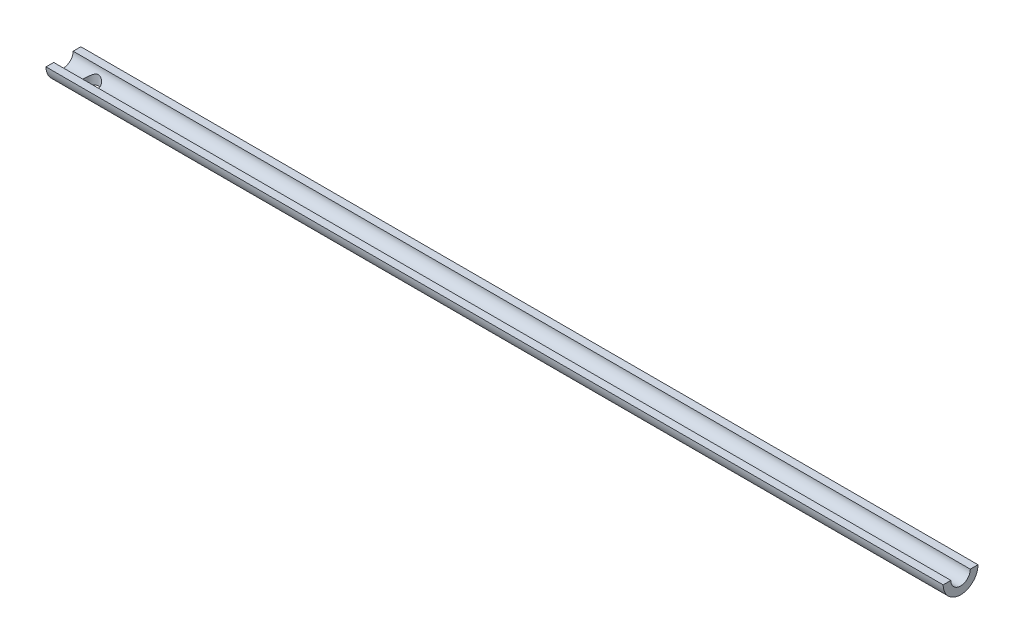
ISO-10303-21;
HEADER;
FILE_DESCRIPTION(('STEP AP214'),'2;1');
FILE_NAME('part.step','',(''),(''),'','','');
FILE_SCHEMA(('AUTOMOTIVE_DESIGN { 1 0 10303 214 1 1 1 1 }'));
ENDSEC;
DATA;
#1=APPLICATION_CONTEXT('core data for automotive mechanical design processes');
#2=APPLICATION_PROTOCOL_DEFINITION('international standard','automotive_design',2000,#1);
#3=PRODUCT_CONTEXT('',#1,'mechanical');
#4=PRODUCT('Part','Part','',(#3));
#5=PRODUCT_RELATED_PRODUCT_CATEGORY('part','',(#4));
#6=PRODUCT_DEFINITION_FORMATION('','',#4);
#7=PRODUCT_DEFINITION_CONTEXT('part definition',#1,'design');
#8=PRODUCT_DEFINITION('design','',#6,#7);
#9=PRODUCT_DEFINITION_SHAPE('','',#8);
#10=(LENGTH_UNIT() NAMED_UNIT(*) SI_UNIT(.MILLI.,.METRE.));
#11=(NAMED_UNIT(*) PLANE_ANGLE_UNIT() SI_UNIT($,.RADIAN.));
#12=(NAMED_UNIT(*) SI_UNIT($,.STERADIAN.) SOLID_ANGLE_UNIT());
#13=UNCERTAINTY_MEASURE_WITH_UNIT(LENGTH_MEASURE(1.E-05),#10,'distance_accuracy_value','');
#14=(GEOMETRIC_REPRESENTATION_CONTEXT(3) GLOBAL_UNCERTAINTY_ASSIGNED_CONTEXT((#13)) GLOBAL_UNIT_ASSIGNED_CONTEXT((#10,
#11,#12)) REPRESENTATION_CONTEXT('',''));
#15=CARTESIAN_POINT('',(0.,0.,0.));
#16=DIRECTION('',(0.,0.,1.));
#17=DIRECTION('',(1.,0.,0.));
#18=AXIS2_PLACEMENT_3D('',#15,#16,#17);
#19=CARTESIAN_POINT('',(22.225,19.05,-19.05));
#20=DIRECTION('',(0.,-1.,0.));
#21=DIRECTION('',(0.,0.,-1.));
#22=AXIS2_PLACEMENT_3D('',#19,#20,#21);
#23=CYLINDRICAL_SURFACE('',#22,6.3881);
#24=CARTESIAN_POINT('',(22.225,14.2748168883277,-25.4381));
#25=CARTESIAN_POINT('',(22.1052327505586,14.274814039197,-25.438098820239));
#26=CARTESIAN_POINT('',(21.9854232199568,14.2702884914255,-25.434722705346));
#27=CARTESIAN_POINT('',(21.7467943496114,14.2524098727596,-25.4212984158853));
#28=CARTESIAN_POINT('',(21.6279757318108,14.2390508531921,-25.4112457451437));
#29=CARTESIAN_POINT('',(21.391989247755,14.2041124463885,-25.3846703843907));
#30=CARTESIAN_POINT('',(21.2748262908106,14.1825124472511,-25.3681314684063));
#31=CARTESIAN_POINT('',(21.0430772688876,14.1320222996425,-25.3289098996023));
#32=CARTESIAN_POINT('',(20.9284929760754,14.1031272949173,-25.3062231534574));
#33=CARTESIAN_POINT('',(20.6628937152636,14.0279344976932,-25.2461362464194));
#34=CARTESIAN_POINT('',(20.5131367742915,13.9790835823443,-25.2063647831223));
#35=CARTESIAN_POINT('',(20.2197915539984,13.872691360835,-25.1171643565981));
#36=CARTESIAN_POINT('',(20.0762034876994,13.8151497548793,-25.0677350601958));
#37=CARTESIAN_POINT('',(19.7949137156383,13.6935489766235,-24.9597591825487));
#38=CARTESIAN_POINT('',(19.6572275618893,13.6294739278967,-24.9011901993955));
#39=CARTESIAN_POINT('',(19.38806000359,13.4969026275026,-24.775526517402));
#40=CARTESIAN_POINT('',(19.2565784396296,13.4284064895305,-24.7084320377651));
#41=CARTESIAN_POINT('',(18.9529411283808,13.2631960363066,-24.5401352813238));
#42=CARTESIAN_POINT('',(18.7833861837941,13.165280037829,-24.4354036163811));
#43=CARTESIAN_POINT('',(18.4554127661199,12.9676436433518,-24.2111534456428));
#44=CARTESIAN_POINT('',(18.2969983423859,12.8679226076486,-24.0916296063123));
#45=CARTESIAN_POINT('',(17.9916955279358,12.6695771350591,-23.8381399094518));
#46=CARTESIAN_POINT('',(17.844797916668,12.5709518763171,-23.7041858133124));
#47=CARTESIAN_POINT('',(17.5630287768574,12.377227219413,-23.4219090426535));
#48=CARTESIAN_POINT('',(17.4281532350785,12.2821266508703,-23.2735911978334));
#49=CARTESIAN_POINT('',(17.1968030315328,12.116024581123,-22.9935009714856));
#50=CARTESIAN_POINT('',(17.0980096988068,12.0439771142936,-22.8642589194477));
#51=CARTESIAN_POINT('',(16.9094822217991,11.9048579164068,-22.5968083574661));
#52=CARTESIAN_POINT('',(16.8197463220996,11.8377852218613,-22.458601593532));
#53=CARTESIAN_POINT('',(16.6502489019262,11.7098953788035,-22.1736860304114));
#54=CARTESIAN_POINT('',(16.5704756501414,11.6490708881213,-22.0269875342961));
#55=CARTESIAN_POINT('',(16.4217248912558,11.5348081874029,-21.7254560091128));
#56=CARTESIAN_POINT('',(16.3527455885979,11.4813687490478,-21.570624338722));
#57=CARTESIAN_POINT('',(16.236800327613,11.391030518359,-21.2792890376119));
#58=CARTESIAN_POINT('',(16.1880784876675,11.3528545766901,-21.1438784582453));
#59=CARTESIAN_POINT('',(16.0995036586541,11.2831904619205,-20.8685221342051));
#60=CARTESIAN_POINT('',(16.0596489769715,11.2517010125157,-20.7285772609168));
#61=CARTESIAN_POINT('',(15.9893577143691,11.1960106550603,-20.4449632728009));
#62=CARTESIAN_POINT('',(15.9589179593264,11.1718072906723,-20.3012954308672));
#63=CARTESIAN_POINT('',(15.9078996341911,11.1311684808592,-20.0111256332983));
#64=CARTESIAN_POINT('',(15.8873211817279,11.1147331280937,-19.8646236438781));
#65=CARTESIAN_POINT('',(15.8563091344789,11.0899428570188,-19.5693389342992));
#66=CARTESIAN_POINT('',(15.8459116143604,11.0816166729331,-19.4205499878728));
#67=CARTESIAN_POINT('',(15.8355683342188,11.0733339604599,-19.1223745389552));
#68=CARTESIAN_POINT('',(15.8356225943578,11.0733774482177,-18.9729880353119));
#69=CARTESIAN_POINT('',(15.8461821918462,11.08183330832,-18.674820165106));
#70=CARTESIAN_POINT('',(15.8566878632595,11.0902459481718,-18.5260388180391));
#71=CARTESIAN_POINT('',(15.8879682746795,11.1152500440522,-18.2302633786246));
#72=CARTESIAN_POINT('',(15.9087427748555,11.1318413090672,-18.0832692446184));
#73=CARTESIAN_POINT('',(15.9587988399754,11.17171120127,-17.8001806978062));
#74=CARTESIAN_POINT('',(15.9875478006364,11.194570357738,-17.663932376185));
#75=CARTESIAN_POINT('',(16.0535128731702,11.2468450892423,-17.394766708718));
#76=CARTESIAN_POINT('',(16.0907318592173,11.2762628897858,-17.2618505106137));
#77=CARTESIAN_POINT('',(16.2144072674728,11.373608880426,-16.8692305180578));
#78=CARTESIAN_POINT('',(16.3129176866269,11.4506583306336,-16.6154590497942));
#79=CARTESIAN_POINT('',(16.5487543799121,11.6327245816322,-16.104704906669));
#80=CARTESIAN_POINT('',(16.6889004366822,11.7397170423852,-15.849755763419));
#81=CARTESIAN_POINT('',(16.9979199787261,11.9708587232794,-15.3665496063558));
#82=CARTESIAN_POINT('',(17.1668093956242,12.0950174509934,-15.1383075145394));
#83=CARTESIAN_POINT('',(17.5670121213274,12.3810020543123,-14.665274929368));
#84=CARTESIAN_POINT('',(17.8040164577472,12.5453161145503,-14.4267751965018));
#85=CARTESIAN_POINT('',(18.1837107008651,12.794970708512,-14.0998748619976));
#86=CARTESIAN_POINT('',(18.3144433738575,12.8788011891895,-13.995965062543));
#87=CARTESIAN_POINT('',(18.5838879278762,13.0459289928987,-13.798522513847));
#88=CARTESIAN_POINT('',(18.7225988644655,13.1292263777442,-13.7049885401775));
#89=CARTESIAN_POINT('',(18.9945810952623,13.2857302297115,-13.5368040698004));
#90=CARTESIAN_POINT('',(19.1271442316493,13.359150887039,-13.4612053897186));
#91=CARTESIAN_POINT('',(19.3989101114831,13.5024049524905,-13.3189821428806));
#92=CARTESIAN_POINT('',(19.5381136329472,13.5722379382661,-13.2523586312096));
#93=CARTESIAN_POINT('',(19.8230448858232,13.7062186177797,-13.1286406029027));
#94=CARTESIAN_POINT('',(19.9687610275338,13.7703758495949,-13.0715299516153));
#95=CARTESIAN_POINT('',(20.2668341801483,13.8907208175741,-12.9673723099269));
#96=CARTESIAN_POINT('',(20.4191880812254,13.9469122343758,-12.92032066658));
#97=CARTESIAN_POINT('',(20.7912235461618,14.0683828350802,-12.8208690102389));
#98=CARTESIAN_POINT('',(21.0140304710439,14.1286869473467,-12.7735149467321));
#99=CARTESIAN_POINT('',(21.3550709422428,14.1975048821836,-12.7203624780865));
#100=CARTESIAN_POINT('',(21.4698259969392,14.216833239897,-12.7056278818068));
#101=CARTESIAN_POINT('',(21.7010015099083,14.2475153934693,-12.6823697504844));
#102=CARTESIAN_POINT('',(21.8174211522823,14.2588729681325,-12.6738432722132));
#103=CARTESIAN_POINT('',(22.0518034268537,14.2731181201431,-12.6631638607535));
#104=CARTESIAN_POINT('',(22.1697711544455,14.275952379488,-12.6610510477804));
#105=CARTESIAN_POINT('',(22.4055243717252,14.272859527311,-12.6633633503319));
#106=CARTESIAN_POINT('',(22.523309864435,14.2669325626669,-12.667788356253));
#107=CARTESIAN_POINT('',(22.7578335159747,14.2466033188336,-12.6830749223987));
#108=CARTESIAN_POINT('',(22.8745705150571,14.2321926057104,-12.6939428878268));
#109=CARTESIAN_POINT('',(23.1061001327548,14.1955559690321,-12.721880598897));
#110=CARTESIAN_POINT('',(23.2208916572662,14.173325791437,-12.738953720512));
#111=CARTESIAN_POINT('',(23.4763689472632,14.1155119007245,-12.7840060094082));
#112=CARTESIAN_POINT('',(23.6163197884937,14.0779768079834,-12.8136471467515));
#113=CARTESIAN_POINT('',(23.8914885447928,13.9940779011198,-12.8814709642971));
#114=CARTESIAN_POINT('',(24.0267024745981,13.9477068547341,-12.9196606460224));
#115=CARTESIAN_POINT('',(24.2923196201918,13.8479820640947,-13.0040527859047));
#116=CARTESIAN_POINT('',(24.4227106517279,13.7946120023126,-13.0502740534132));
#117=CARTESIAN_POINT('',(24.6782444374999,13.6827292792931,-13.1501501894327));
#118=CARTESIAN_POINT('',(24.8033887039598,13.6242181150877,-13.2038028965967));
#119=CARTESIAN_POINT('',(25.1052107630794,13.4756299814114,-13.3446216061781));
#120=CARTESIAN_POINT('',(25.2789862612766,13.3834582881012,-13.4358190301769));
#121=CARTESIAN_POINT('',(25.6158595113909,13.1950169831623,-13.632623988902));
#122=CARTESIAN_POINT('',(25.7789527938587,13.0987456837039,-13.7382374990531));
#123=CARTESIAN_POINT('',(26.0946198453451,12.9050183009142,-13.9635965218095));
#124=CARTESIAN_POINT('',(26.2471829686647,12.807561132448,-14.0833560134276));
#125=CARTESIAN_POINT('',(26.5413065650432,12.6141147392437,-14.3367225644051));
#126=CARTESIAN_POINT('',(26.6828687679256,12.5181252856313,-14.4703274389264));
#127=CARTESIAN_POINT('',(26.9564074532175,12.328486823226,-14.7533840791869));
#128=CARTESIAN_POINT('',(27.0882103425337,12.234893748223,-14.9030417320617));
#129=CARTESIAN_POINT('',(27.3388464398469,12.053837047129,-15.2163803190535));
#130=CARTESIAN_POINT('',(27.4576776089741,11.9663743853756,-15.3800634504718));
#131=CARTESIAN_POINT('',(27.6806361750933,11.800114304431,-15.7205626337706));
#132=CARTESIAN_POINT('',(27.7848030054089,11.7212937774841,-15.8973414355147));
#133=CARTESIAN_POINT('',(27.9770855754591,11.574371780693,-16.263596076572));
#134=CARTESIAN_POINT('',(28.065210382795,11.5062642584022,-16.4530646597339));
#135=CARTESIAN_POINT('',(28.1980367499377,11.4028819491454,-16.7804103597539));
#136=CARTESIAN_POINT('',(28.2475803737627,11.3640992374587,-16.9152387609548));
#137=CARTESIAN_POINT('',(28.3378678150898,11.2931484901818,-17.1894910725617));
#138=CARTESIAN_POINT('',(28.3786139262101,11.2609787306197,-17.3289137742256));
#139=CARTESIAN_POINT('',(28.4507449907862,11.2038678580281,-17.6115357425983));
#140=CARTESIAN_POINT('',(28.4821348986816,11.1789229193997,-17.7547329666805));
#141=CARTESIAN_POINT('',(28.535113997026,11.1367418140565,-18.0440626457928));
#142=CARTESIAN_POINT('',(28.5567028417334,11.1195059192857,-18.1901952041797));
#143=CARTESIAN_POINT('',(28.5897884243429,11.0930655453528,-18.4848850553982));
#144=CARTESIAN_POINT('',(28.6012469622067,11.083891467003,-18.6334493926056));
#145=CARTESIAN_POINT('',(28.6137360302897,11.0738914413023,-18.9312977313757));
#146=CARTESIAN_POINT('',(28.6147666013123,11.0730654612862,-19.08058173012));
#147=CARTESIAN_POINT('',(28.6063814203265,11.0797806612618,-19.3786739591682));
#148=CARTESIAN_POINT('',(28.5969650709103,11.0873223197574,-19.5274821617754));
#149=CARTESIAN_POINT('',(28.5678490540645,11.1106025567673,-19.8234327862726));
#150=CARTESIAN_POINT('',(28.5481496223914,11.1263409473581,-19.9705752462732));
#151=CARTESIAN_POINT('',(28.5001493876858,11.1645910125927,-20.2540929008347));
#152=CARTESIAN_POINT('',(28.4723807386124,11.1866829525395,-20.3906154464951));
#153=CARTESIAN_POINT('',(28.4083353913799,11.2374694305873,-20.6604153824373));
#154=CARTESIAN_POINT('',(28.3720557967089,11.2661662164385,-20.7936916508375));
#155=CARTESIAN_POINT('',(28.2511248753892,11.3614333901978,-21.1875016313292));
#156=CARTESIAN_POINT('',(28.1543473366223,11.4372080948184,-21.4422129056746));
#157=CARTESIAN_POINT('',(27.9223900905762,11.6165141721708,-21.9540971904978));
#158=CARTESIAN_POINT('',(27.7844988582947,11.7219562252637,-22.209345864024));
#159=CARTESIAN_POINT('',(27.4799868092597,11.9502027971903,-22.6934613706351));
#160=CARTESIAN_POINT('',(27.3133511064167,12.0730163063329,-22.9223144310665));
#161=CARTESIAN_POINT('',(26.9184725357559,12.3561083531647,-23.3965975233526));
#162=CARTESIAN_POINT('',(26.6845988963385,12.5189140644807,-23.6358569202021));
#163=CARTESIAN_POINT('',(26.3097726144167,12.7667649539992,-23.9642747646456));
#164=CARTESIAN_POINT('',(26.1806911019354,12.8500714788351,-24.0687552713237));
#165=CARTESIAN_POINT('',(25.9146267016791,13.0163526201005,-24.2674746070618));
#166=CARTESIAN_POINT('',(25.7776446538587,13.0993272708143,-24.3617145218011));
#167=CARTESIAN_POINT('',(25.5062384884342,13.2571050832276,-24.5331675293976));
#168=CARTESIAN_POINT('',(25.372370856074,13.332059569796,-24.6111237875191));
#169=CARTESIAN_POINT('',(25.0977922604518,13.4784825622508,-24.757812386486));
#170=CARTESIAN_POINT('',(24.9570803412751,13.5499505783875,-24.8265434338135));
#171=CARTESIAN_POINT('',(24.6688775014176,13.6872673422313,-24.9542419400898));
#172=CARTESIAN_POINT('',(24.5213962543452,13.7531237467057,-25.0132228094952));
#173=CARTESIAN_POINT('',(24.2195735877817,13.8768276750194,-25.120848164933));
#174=CARTESIAN_POINT('',(24.0652357284725,13.9346792924627,-25.1694979410872));
#175=CARTESIAN_POINT('',(23.6866299101477,14.0604493343227,-25.2728324464126));
#176=CARTESIAN_POINT('',(23.4590175240415,14.1231832380111,-25.3221880751248));
#177=CARTESIAN_POINT('',(23.1105246908656,14.1947371974138,-25.3775200567966));
#178=CARTESIAN_POINT('',(22.9933337449957,14.2148195102463,-25.3928395467874));
#179=CARTESIAN_POINT('',(22.7571877638756,14.2466717278377,-25.4169964197543));
#180=CARTESIAN_POINT('',(22.638234014565,14.2584474141683,-25.425838311429));
#181=CARTESIAN_POINT('',(22.4700071475055,14.2687857455437,-25.4335879574572));
#182=CARTESIAN_POINT('',(22.4210546397125,14.2710447319264,-25.4352788171575));
#183=CARTESIAN_POINT('',(22.3230704575174,14.274060991964,-25.4375351589094));
#184=CARTESIAN_POINT('',(22.2740387729727,14.274818054906,-25.4381004830538));
#185=CARTESIAN_POINT('',(22.225,14.2748168883277,-25.4381));
#186=B_SPLINE_CURVE_WITH_KNOTS('',3,(#24,#25,#26,#27,#28,#29,#30,#31,#32,#33,#34,#35,#36,#37,
#38,#39,#40,#41,#42,#43,#44,#45,#46,#47,#48,#49,#50,#51,#52,#53,#54,#55,#56,#57,#58,#59,#60,#61,
#62,#63,#64,#65,#66,#67,#68,#69,#70,#71,#72,#73,#74,#75,#76,#77,#78,#79,#80,#81,#82,#83,#84,#85,
#86,#87,#88,#89,#90,#91,#92,#93,#94,#95,#96,#97,#98,#99,#100,#101,#102,#103,#104,#105,#106,#107,
#108,#109,#110,#111,#112,#113,#114,#115,#116,#117,#118,#119,#120,#121,#122,#123,#124,#125,#126,
#127,#128,#129,#130,#131,#132,#133,#134,#135,#136,#137,#138,#139,#140,#141,#142,#143,#144,#145,
#146,#147,#148,#149,#150,#151,#152,#153,#154,#155,#156,#157,#158,#159,#160,#161,#162,#163,#164,
#165,#166,#167,#168,#169,#170,#171,#172,#173,#174,#175,#176,#177,#178,#179,#180,#181,#182,#183,
#184,#185),.UNSPECIFIED.,.T.,.F.,(4,2,2,2,2,2,2,2,2,2,2,2,2,2,2,2,2,2,2,2,2,2,2,2,2,2,2,2,2,2,2,
2,2,2,2,2,2,2,2,2,2,2,2,2,2,2,2,2,2,2,2,2,2,2,2,2,2,2,2,2,2,2,2,2,2,2,2,2,2,2,2,2,2,2,2,2,2,2,2,
2,4),(0.,0.359245179244354,0.718732529577265,1.07912496834835,1.43975795434911,1.92638299180333,
2.41302481977301,2.90087873346032,3.3887201062364,4.05400647552527,4.71953342627139,
5.38452198518502,6.04928771807205,6.58256105043039,7.11573083001809,7.64826674527233,
8.18071397959592,8.62692497788757,9.07305072761334,9.51902590735534,9.96500640672432,
10.4125615160274,10.8601174886853,11.3076877672642,11.755247593237,12.1781139864735,
12.6011240875218,13.4465463608487,14.3731857987963,15.300340529297,16.41865715381,
16.978888040889,17.5390527458781,18.0467296558574,18.5544661943329,19.0613325990118,
19.5679640352548,20.2717814497553,20.6233128366701,20.9746774561174,21.3282355284933,
21.6817876737031,22.0356918900225,22.3897889401537,22.8327911014942,23.2761574316288,
23.7205764409554,24.1648664665765,24.8144149542988,25.4642335001755,26.1146996531555,
26.7650633167047,27.4250861772609,28.0852126300074,28.7435285922788,29.4014712843747,
29.8474041775792,30.2932206699093,30.7388006655533,31.1843963782243,31.6316652929727,
32.0789324576128,32.5262252005765,32.9735076890773,33.3962109197098,33.8190582172625,
34.6641558493559,35.5869061096163,36.5101356832614,37.6220449975749,38.1790804018281,
38.7360566929923,39.2519534995187,39.7679225673892,40.2831759547696,40.7981648627619,
41.5185079170742,41.8777735707034,42.2367889211431,42.383861445691,42.5309546023652),.UNSPECIFIED.);
#187=CARTESIAN_POINT('',(22.225,14.2748168883277,-25.4381));
#188=VERTEX_POINT('',#187);
#189=EDGE_CURVE('E140',#188,#188,#186,.T.);
#190=ORIENTED_EDGE('',*,*,#189,.T.);
#191=EDGE_LOOP('',(#190));
#192=FACE_BOUND('',#191,.T.);
#193=CARTESIAN_POINT('',(22.225,5.5499,-19.05));
#194=DIRECTION('',(0.,-1.,0.));
#195=DIRECTION('',(0.,0.,-1.));
#196=AXIS2_PLACEMENT_3D('',#193,#194,#195);
#197=CIRCLE('',#196,6.3881);
#198=CARTESIAN_POINT('',(26.5756166654855,5.5499,-23.727601547802));
#199=VERTEX_POINT('',#198);
#200=CARTESIAN_POINT('',(26.5756166654855,5.5499,-14.372398452198));
#201=VERTEX_POINT('',#200);
#202=EDGE_CURVE('E147',#199,#201,#197,.T.);
#203=ORIENTED_EDGE('',*,*,#202,.T.);
#204=CARTESIAN_POINT('',(26.5756166654855,5.5499,-14.3723984521979));
#205=CARTESIAN_POINT('',(26.4470610944759,5.59132755261554,-14.2528246829143));
#206=CARTESIAN_POINT('',(26.313555714073,5.63270805644949,-14.138541464801));
#207=CARTESIAN_POINT('',(26.03731699547,5.71428971705218,-13.9211648709812));
#208=CARTESIAN_POINT('',(25.8945806749022,5.75449048650765,-13.8180751408197));
#209=CARTESIAN_POINT('',(25.6000378450775,5.83275808355556,-13.6233772626062));
#210=CARTESIAN_POINT('',(25.4481967774531,5.87081555786931,-13.5318175633457));
#211=CARTESIAN_POINT('',(25.1367962468939,5.94349483786564,-13.3613476010714));
#212=CARTESIAN_POINT('',(24.9772374972449,5.97811696015215,-13.2824361719727));
#213=CARTESIAN_POINT('',(24.6507872380917,6.04293983812956,-13.1376945402041));
#214=CARTESIAN_POINT('',(24.4838740493613,6.07312620244064,-13.0719066791562));
#215=CARTESIAN_POINT('',(24.1443557941446,6.12789808088601,-12.9544160919302));
#216=CARTESIAN_POINT('',(23.9717537283666,6.15248649531051,-12.9027060693115));
#217=CARTESIAN_POINT('',(23.6223693605185,6.19513791689075,-12.8140077523969));
#218=CARTESIAN_POINT('',(23.4455958126287,6.21321348405618,-12.7769911077839));
#219=CARTESIAN_POINT('',(23.0889780053287,6.24220060451498,-12.7180162924959));
#220=CARTESIAN_POINT('',(22.9091340286608,6.25311281383877,-12.6960567428627));
#221=CARTESIAN_POINT('',(22.5607565037421,6.26682946525837,-12.668509455956));
#222=CARTESIAN_POINT('',(22.392325756298,6.27015420335676,-12.661870719395));
#223=CARTESIAN_POINT('',(22.0554689277697,6.27012468223717,-12.6619294709274));
#224=CARTESIAN_POINT('',(21.8870428467131,6.26677064154501,-12.6686265226813));
#225=CARTESIAN_POINT('',(21.5514341501246,6.25350071767312,-12.6952787987374));
#226=CARTESIAN_POINT('',(21.3842521134288,6.24358195215563,-12.7152398468052));
#227=CARTESIAN_POINT('',(21.0524618911335,6.21752846455082,-12.7681851052437));
#228=CARTESIAN_POINT('',(20.8878536758825,6.20139381412808,-12.8011691654688));
#229=CARTESIAN_POINT('',(20.5687731981053,6.16420155592517,-12.8782412029691));
#230=CARTESIAN_POINT('',(20.4141569522522,6.14336261317757,-12.9218412488043));
#231=CARTESIAN_POINT('',(20.1092163457311,6.09706013170279,-13.0203263297494));
#232=CARTESIAN_POINT('',(19.9588935855086,6.07159489384906,-13.0752155120686));
#233=CARTESIAN_POINT('',(19.6634280792162,6.01675739253874,-13.1958027762652));
#234=CARTESIAN_POINT('',(19.5182842596256,5.98738594482135,-13.2614986020529));
#235=CARTESIAN_POINT('',(19.2338224600016,5.92549267095592,-13.4032358299568));
#236=CARTESIAN_POINT('',(19.094505633113,5.8929702254184,-13.4792792672889));
#237=CARTESIAN_POINT('',(18.7631846892154,5.81091996386057,-13.6764320685504));
#238=CARTESIAN_POINT('',(18.5745771751937,5.76014118938911,-13.8027701366127));
#239=CARTESIAN_POINT('',(18.2127225602333,5.65622498938724,-14.0740057605356));
#240=CARTESIAN_POINT('',(18.0394366254259,5.60309407095739,-14.2188539780663));
#241=CARTESIAN_POINT('',(17.8743833345145,5.54990000000001,-14.3723984521979));
#242=B_SPLINE_CURVE_WITH_KNOTS('',3,(#204,#205,#206,#207,#208,#209,#210,#211,#212,#213,#214,
#215,#216,#217,#218,#219,#220,#221,#222,#223,#224,#225,#226,#227,#228,#229,#230,#231,#232,#233,
#234,#235,#236,#237,#238,#239,#240,#241),.UNSPECIFIED.,.F.,.F.,(4,2,2,2,2,2,2,2,2,2,2,2,2,2,2,2,
2,2,4),(0.,0.541042114337712,1.08225991246494,1.62568095379624,2.16905186653628,
2.71414851206538,3.2589620977979,3.80271931620497,4.34642672960818,4.8515596839464,
5.35667611089452,5.86201446380214,6.36734699070545,6.8527976689117,7.33842700321732,
7.82395508165867,8.30957879440682,9.00611771450594,9.70083731116083),.UNSPECIFIED.);
#243=CARTESIAN_POINT('',(17.8743833345145,5.5499,-14.3723984521979));
#244=VERTEX_POINT('',#243);
#245=EDGE_CURVE('E187',#201,#244,#242,.T.);
#246=ORIENTED_EDGE('',*,*,#245,.T.);
#247=CARTESIAN_POINT('',(17.8743833345146,5.5499,-23.7276015478021));
#248=VERTEX_POINT('',#247);
#249=EDGE_CURVE('E200',#244,#248,#197,.T.);
#250=ORIENTED_EDGE('',*,*,#249,.T.);
#251=CARTESIAN_POINT('',(17.8743833345146,5.5499,-23.7276015478021));
#252=CARTESIAN_POINT('',(18.0029389055241,5.59132755261554,-23.8471753170857));
#253=CARTESIAN_POINT('',(18.136444285927,5.63270805644949,-23.961458535199));
#254=CARTESIAN_POINT('',(18.4126830045301,5.71428971705218,-24.1788351290188));
#255=CARTESIAN_POINT('',(18.5554193250979,5.75449048650764,-24.2819248591803));
#256=CARTESIAN_POINT('',(18.8499621549225,5.83275808355556,-24.4766227373938));
#257=CARTESIAN_POINT('',(19.001803222547,5.87081555786931,-24.5681824366543));
#258=CARTESIAN_POINT('',(19.3132037531061,5.94349483786564,-24.7386523989286));
#259=CARTESIAN_POINT('',(19.4727625027551,5.97811696015215,-24.8175638280273));
#260=CARTESIAN_POINT('',(19.7992127619083,6.04293983812956,-24.9623054597959));
#261=CARTESIAN_POINT('',(19.9661259506387,6.07312620244064,-25.0280933208438));
#262=CARTESIAN_POINT('',(20.3056442058555,6.127898080886,-25.1455839080698));
#263=CARTESIAN_POINT('',(20.4782462716335,6.15248649531051,-25.1972939306885));
#264=CARTESIAN_POINT('',(20.8276306394816,6.19513791689075,-25.2859922476031));
#265=CARTESIAN_POINT('',(21.0044041873713,6.21321348405618,-25.3230088922161));
#266=CARTESIAN_POINT('',(21.3610219946713,6.24220060451497,-25.3819837075041));
#267=CARTESIAN_POINT('',(21.5408659713392,6.25311281383876,-25.4039432571372));
#268=CARTESIAN_POINT('',(21.8892434962579,6.26682946525836,-25.431490544044));
#269=CARTESIAN_POINT('',(22.057674243702,6.27015420335676,-25.438129280605));
#270=CARTESIAN_POINT('',(22.3945310722303,6.27012468223717,-25.4380705290726));
#271=CARTESIAN_POINT('',(22.5629571532869,6.266770641545,-25.4313734773187));
#272=CARTESIAN_POINT('',(22.8985658498754,6.25350071767312,-25.4047212012626));
#273=CARTESIAN_POINT('',(23.0657478865712,6.24358195215563,-25.3847601531948));
#274=CARTESIAN_POINT('',(23.3975381088665,6.21752846455082,-25.3318148947563));
#275=CARTESIAN_POINT('',(23.5621463241175,6.20139381412807,-25.2988308345312));
#276=CARTESIAN_POINT('',(23.8812268018947,6.16420155592516,-25.2217587970309));
#277=CARTESIAN_POINT('',(24.0358430477478,6.14336261317756,-25.1781587511957));
#278=CARTESIAN_POINT('',(24.3407836542689,6.09706013170278,-25.0796736702505));
#279=CARTESIAN_POINT('',(24.4911064144914,6.07159489384906,-25.0247844879314));
#280=CARTESIAN_POINT('',(24.7865719207838,6.01675739253873,-24.9041972237348));
#281=CARTESIAN_POINT('',(24.9317157403744,5.98738594482134,-24.838501397947));
#282=CARTESIAN_POINT('',(25.2161775399985,5.92549267095591,-24.6967641700432));
#283=CARTESIAN_POINT('',(25.355494366887,5.89297022541839,-24.6207207327111));
#284=CARTESIAN_POINT('',(25.6868153107846,5.81091996386056,-24.4235679314496));
#285=CARTESIAN_POINT('',(25.8754228248063,5.7601411893891,-24.2972298633872));
#286=CARTESIAN_POINT('',(26.2372774397667,5.65622498938724,-24.0259942394644));
#287=CARTESIAN_POINT('',(26.410563374574,5.60309407095739,-23.8811460219337));
#288=CARTESIAN_POINT('',(26.5756166654854,5.54990000000001,-23.7276015478021));
#289=B_SPLINE_CURVE_WITH_KNOTS('',3,(#251,#252,#253,#254,#255,#256,#257,#258,#259,#260,#261,
#262,#263,#264,#265,#266,#267,#268,#269,#270,#271,#272,#273,#274,#275,#276,#277,#278,#279,#280,
#281,#282,#283,#284,#285,#286,#287,#288),.UNSPECIFIED.,.F.,.F.,(4,2,2,2,2,2,2,2,2,2,2,2,2,2,2,2,
2,2,4),(0.,0.541042114337714,1.08225991246494,1.62568095379624,2.16905186653627,
2.71414851206538,3.25896209779789,3.80271931620497,4.34642672960817,4.85155968394639,
5.35667611089451,5.86201446380212,6.36734699070544,6.85279766891169,7.33842700321731,
7.82395508165866,8.30957879440682,9.00611771450592,9.70083731116079),.UNSPECIFIED.);
#290=EDGE_CURVE('E163',#248,#199,#289,.T.);
#291=ORIENTED_EDGE('',*,*,#290,.T.);
#292=EDGE_LOOP('',(#203,#246,#250,#291));
#293=FACE_BOUND('',#292,.T.);
#294=ADVANCED_FACE('F41',(#192,#293),#23,.F.);
#295=CARTESIAN_POINT('',(735.584,19.05,0.));
#296=DIRECTION('',(-1.,0.,0.));
#297=DIRECTION('',(0.,0.,1.));
#298=AXIS2_PLACEMENT_3D('',#295,#296,#297);
#299=PLANE('',#298);
#300=CARTESIAN_POINT('',(735.584,19.05,-19.05));
#301=DIRECTION('',(-1.,0.,0.));
#302=DIRECTION('',(0.,0.,1.));
#303=AXIS2_PLACEMENT_3D('',#300,#301,#302);
#304=CIRCLE('',#303,14.2875);
#305=CARTESIAN_POINT('',(735.584,19.05,-33.3375));
#306=VERTEX_POINT('',#305);
#307=CARTESIAN_POINT('',(735.584,19.05,-4.7625));
#308=VERTEX_POINT('',#307);
#309=EDGE_CURVE('E57',#306,#308,#304,.T.);
#310=ORIENTED_EDGE('',*,*,#309,.F.);
#311=DIRECTION('',(0.,0.,-1.));
#312=VECTOR('',#311,1.);
#313=CARTESIAN_POINT('',(735.584,19.05,0.));
#314=LINE('',#313,#312);
#315=CARTESIAN_POINT('',(735.584,19.05,-27.0256));
#316=VERTEX_POINT('',#315);
#317=EDGE_CURVE('E118',#316,#306,#314,.T.);
#318=ORIENTED_EDGE('',*,*,#317,.F.);
#319=CARTESIAN_POINT('',(735.584,19.05,-19.05));
#320=DIRECTION('',(1.,0.,0.));
#321=DIRECTION('',(0.,0.,-1.));
#322=AXIS2_PLACEMENT_3D('',#319,#320,#321);
#323=CIRCLE('',#322,7.9756);
#324=CARTESIAN_POINT('',(735.584,19.05,-11.0744));
#325=VERTEX_POINT('',#324);
#326=EDGE_CURVE('E143',#325,#316,#323,.T.);
#327=ORIENTED_EDGE('',*,*,#326,.F.);
#328=EDGE_CURVE('E119',#308,#325,#314,.T.);
#329=ORIENTED_EDGE('',*,*,#328,.F.);
#330=EDGE_LOOP('',(#310,#318,#327,#329));
#331=FACE_BOUND('',#330,.T.);
#332=ADVANCED_FACE('F120',(#331),#299,.F.);
#333=CARTESIAN_POINT('',(0.,19.05,0.));
#334=DIRECTION('',(0.,-1.,0.));
#335=DIRECTION('',(0.,0.,-1.));
#336=AXIS2_PLACEMENT_3D('',#333,#334,#335);
#337=PLANE('',#336);
#338=DIRECTION('',(-1.,0.,0.));
#339=VECTOR('',#338,1.);
#340=CARTESIAN_POINT('',(735.584,19.05,-33.3375));
#341=LINE('',#340,#339);
#342=CARTESIAN_POINT('',(0.,19.05,-33.3375));
#343=VERTEX_POINT('',#342);
#344=EDGE_CURVE('E104',#343,#306,#341,.F.);
#345=ORIENTED_EDGE('',*,*,#344,.F.);
#346=DIRECTION('',(0.,0.,1.));
#347=VECTOR('',#346,1.);
#348=CARTESIAN_POINT('',(0.,19.05,0.));
#349=LINE('',#348,#347);
#350=CARTESIAN_POINT('',(0.,19.05,-27.0256));
#351=VERTEX_POINT('',#350);
#352=EDGE_CURVE('E127',#343,#351,#349,.T.);
#353=ORIENTED_EDGE('',*,*,#352,.T.);
#354=DIRECTION('',(1.,0.,0.));
#355=VECTOR('',#354,1.);
#356=CARTESIAN_POINT('',(0.,19.05,-27.0256));
#357=LINE('',#356,#355);
#358=EDGE_CURVE('E123',#351,#316,#357,.T.);
#359=ORIENTED_EDGE('',*,*,#358,.T.);
#360=ORIENTED_EDGE('',*,*,#317,.T.);
#361=EDGE_LOOP('',(#345,#353,#359,#360));
#362=FACE_BOUND('',#361,.T.);
#363=ADVANCED_FACE('F124',(#362),#337,.F.);
#364=DIRECTION('',(-1.,0.,0.));
#365=VECTOR('',#364,1.);
#366=CARTESIAN_POINT('',(735.584,19.05,-4.7625));
#367=LINE('',#366,#365);
#368=CARTESIAN_POINT('',(0.,19.05,-4.7625));
#369=VERTEX_POINT('',#368);
#370=EDGE_CURVE('E115',#308,#369,#367,.T.);
#371=ORIENTED_EDGE('',*,*,#370,.F.);
#372=ORIENTED_EDGE('',*,*,#328,.T.);
#373=DIRECTION('',(1.,0.,0.));
#374=VECTOR('',#373,1.);
#375=CARTESIAN_POINT('',(0.,19.05,-11.0744));
#376=LINE('',#375,#374);
#377=CARTESIAN_POINT('',(0.,19.05,-11.0744));
#378=VERTEX_POINT('',#377);
#379=EDGE_CURVE('E129',#325,#378,#376,.F.);
#380=ORIENTED_EDGE('',*,*,#379,.T.);
#381=EDGE_CURVE('E126',#378,#369,#349,.T.);
#382=ORIENTED_EDGE('',*,*,#381,.T.);
#383=EDGE_LOOP('',(#371,#372,#380,#382));
#384=FACE_BOUND('',#383,.T.);
#385=ADVANCED_FACE('F207',(#384),#337,.F.);
#386=CARTESIAN_POINT('',(22.225,5.5499,-19.05));
#387=DIRECTION('',(0.,-1.,0.));
#388=DIRECTION('',(0.,0.,-1.));
#389=AXIS2_PLACEMENT_3D('',#386,#387,#388);
#390=CYLINDRICAL_SURFACE('',#389,8.128);
#391=CARTESIAN_POINT('',(28.8721368091833,5.5499,-14.372398452198));
#392=CARTESIAN_POINT('',(28.9919571535882,5.49088894192342,-14.5426548304234));
#393=CARTESIAN_POINT('',(29.1055544692101,5.43376135783852,-14.7179982455272));
#394=CARTESIAN_POINT('',(29.3195522483999,5.32438982673138,-15.0781515503321));
#395=CARTESIAN_POINT('',(29.4199450599895,5.27214871642926,-15.2629668435165));
#396=CARTESIAN_POINT('',(29.6070210371572,5.17353824347379,-15.6419239747327));
#397=CARTESIAN_POINT('',(29.6936470190858,5.12719352387038,-15.8361005607872));
#398=CARTESIAN_POINT('',(29.85183896068,5.04169862182928,-16.2319976629155));
#399=CARTESIAN_POINT('',(29.9234076806348,5.00254712090162,-16.4337167882958));
#400=CARTESIAN_POINT('',(30.050957436062,4.93224382192419,-16.8442893930487));
#401=CARTESIAN_POINT('',(30.106876325773,4.90112395463966,-17.0531677195435));
#402=CARTESIAN_POINT('',(30.2020496191653,4.84788627204154,-17.4758374789266));
#403=CARTESIAN_POINT('',(30.2413031155405,4.82576894685184,-17.6896291786436));
#404=CARTESIAN_POINT('',(30.3025165783279,4.79118133340578,-18.1198459841476));
#405=CARTESIAN_POINT('',(30.324524009335,4.77868456914008,-18.336262185679));
#406=CARTESIAN_POINT('',(30.3511041622867,4.76358270285577,-18.7704974417876));
#407=CARTESIAN_POINT('',(30.3556783098803,4.76097679198879,-18.9883163801933));
#408=CARTESIAN_POINT('',(30.3476218408211,4.76555905165302,-19.4083292666414));
#409=CARTESIAN_POINT('',(30.3361677982571,4.77207744870191,-19.6105544272191));
#410=CARTESIAN_POINT('',(30.2982664237246,4.79357482639452,-20.0131335049234));
#411=CARTESIAN_POINT('',(30.2718196032329,4.80855351841625,-20.213487485648));
#412=CARTESIAN_POINT('',(30.204183467123,4.84666025536951,-20.611354130093));
#413=CARTESIAN_POINT('',(30.1629617989221,4.86980618240925,-20.8088595612128));
#414=CARTESIAN_POINT('',(30.0662615518385,4.92371084011862,-21.1992917213892));
#415=CARTESIAN_POINT('',(30.0107819256697,4.9544701300045,-21.3922181129651));
#416=CARTESIAN_POINT('',(29.8850240922056,5.02354538099242,-21.7757820586069));
#417=CARTESIAN_POINT('',(29.8144954385921,5.06198842750792,-21.9663144226984));
#418=CARTESIAN_POINT('',(29.6599520940614,5.14523271014308,-22.3404167896121));
#419=CARTESIAN_POINT('',(29.5759351388385,5.19003501365617,-22.523985617045));
#420=CARTESIAN_POINT('',(29.3954745378408,5.28489615228498,-22.8826002844754));
#421=CARTESIAN_POINT('',(29.2990768528974,5.33493542507263,-23.0576745032413));
#422=CARTESIAN_POINT('',(29.0943700788441,5.43938432264858,-23.3992282512811));
#423=CARTESIAN_POINT('',(28.9860670546778,5.49379171840729,-23.5657120938187));
#424=CARTESIAN_POINT('',(28.8721368091833,5.5499,-23.727601547802));
#425=B_SPLINE_CURVE_WITH_KNOTS('',3,(#391,#392,#393,#394,#395,#396,#397,#398,#399,#400,#401,
#402,#403,#404,#405,#406,#407,#408,#409,#410,#411,#412,#413,#414,#415,#416,#417,#418,#419,#420,
#421,#422,#423,#424),.UNSPECIFIED.,.F.,.F.,(4,2,2,2,2,2,2,2,2,2,2,2,2,2,2,2,4),(0.,
0.649091007459579,1.29855651972366,1.95065294375291,2.60262972145,3.25715991793448,
3.91172574413112,4.56448368573021,5.217188245326,5.82441412463458,6.43161928975327,
7.04016226144614,7.64874994507047,8.26838960324475,8.88813339043327,9.50563963812057,
10.1228327544723),.UNSPECIFIED.);
#426=CARTESIAN_POINT('',(28.8721368091833,5.5499,-14.372398452198));
#427=VERTEX_POINT('',#426);
#428=CARTESIAN_POINT('',(28.8721368091833,5.5499,-23.727601547802));
#429=VERTEX_POINT('',#428);
#430=EDGE_CURVE('E61',#427,#429,#425,.T.);
#431=ORIENTED_EDGE('',*,*,#430,.F.);
#432=CARTESIAN_POINT('',(22.225,5.5499,-19.05));
#433=DIRECTION('',(0.,-1.,0.));
#434=DIRECTION('',(0.,0.,-1.));
#435=AXIS2_PLACEMENT_3D('',#432,#433,#434);
#436=CIRCLE('',#435,8.128);
#437=EDGE_CURVE('E191',#429,#427,#436,.T.);
#438=ORIENTED_EDGE('',*,*,#437,.F.);
#439=EDGE_LOOP('',(#431,#438));
#440=FACE_BOUND('',#439,.T.);
#441=ADVANCED_FACE('F154',(#440),#390,.F.);
#442=CARTESIAN_POINT('',(15.5778631908167,5.5499,-23.727601547802));
#443=CARTESIAN_POINT('',(15.4580428464118,5.49088894192341,-23.5573451695766));
#444=CARTESIAN_POINT('',(15.3444455307899,5.43376135783852,-23.3820017544728));
#445=CARTESIAN_POINT('',(15.1304477516001,5.32438982673138,-23.0218484496679));
#446=CARTESIAN_POINT('',(15.0300549400105,5.27214871642926,-22.8370331564835));
#447=CARTESIAN_POINT('',(14.8429789628428,5.17353824347379,-22.4580760252673));
#448=CARTESIAN_POINT('',(14.7563529809142,5.12719352387038,-22.2638994392128));
#449=CARTESIAN_POINT('',(14.59816103932,5.04169862182928,-21.8680023370845));
#450=CARTESIAN_POINT('',(14.5265923193652,5.00254712090161,-21.6662832117042));
#451=CARTESIAN_POINT('',(14.399042563938,4.93224382192419,-21.2557106069513));
#452=CARTESIAN_POINT('',(14.343123674227,4.90112395463966,-21.0468322804565));
#453=CARTESIAN_POINT('',(14.2479503808347,4.84788627204154,-20.6241625210734));
#454=CARTESIAN_POINT('',(14.2086968844595,4.82576894685183,-20.4103708213564));
#455=CARTESIAN_POINT('',(14.1474834216721,4.79118133340578,-19.9801540158524));
#456=CARTESIAN_POINT('',(14.125475990665,4.77868456914008,-19.763737814321));
#457=CARTESIAN_POINT('',(14.0988958377133,4.76358270285577,-19.3295025582124));
#458=CARTESIAN_POINT('',(14.0943216901197,4.76097679198879,-19.1116836198067));
#459=CARTESIAN_POINT('',(14.1023781591789,4.76555905165302,-18.6916707333586));
#460=CARTESIAN_POINT('',(14.1138322017429,4.77207744870191,-18.4894455727809));
#461=CARTESIAN_POINT('',(14.1517335762754,4.79357482639452,-18.0868664950766));
#462=CARTESIAN_POINT('',(14.1781803967671,4.80855351841626,-17.886512514352));
#463=CARTESIAN_POINT('',(14.245816532877,4.84666025536951,-17.488645869907));
#464=CARTESIAN_POINT('',(14.2870382010779,4.86980618240925,-17.2911404387872));
#465=CARTESIAN_POINT('',(14.3837384481615,4.92371084011862,-16.9007082786108));
#466=CARTESIAN_POINT('',(14.4392180743303,4.9544701300045,-16.7077818870349));
#467=CARTESIAN_POINT('',(14.5649759077944,5.02354538099242,-16.3242179413931));
#468=CARTESIAN_POINT('',(14.6355045614079,5.06198842750792,-16.1336855773016));
#469=CARTESIAN_POINT('',(14.7900479059386,5.14523271014307,-15.7595832103879));
#470=CARTESIAN_POINT('',(14.8740648611615,5.19003501365617,-15.576014382955));
#471=CARTESIAN_POINT('',(15.0545254621592,5.28489615228498,-15.2173997155246));
#472=CARTESIAN_POINT('',(15.1509231471026,5.33493542507263,-15.0423254967587));
#473=CARTESIAN_POINT('',(15.3556299211559,5.43938432264858,-14.7007717487189));
#474=CARTESIAN_POINT('',(15.4639329453222,5.49379171840729,-14.5342879061814));
#475=CARTESIAN_POINT('',(15.5778631908167,5.5499,-14.372398452198));
#476=B_SPLINE_CURVE_WITH_KNOTS('',3,(#442,#443,#444,#445,#446,#447,#448,#449,#450,#451,#452,
#453,#454,#455,#456,#457,#458,#459,#460,#461,#462,#463,#464,#465,#466,#467,#468,#469,#470,#471,
#472,#473,#474,#475),.UNSPECIFIED.,.F.,.F.,(4,2,2,2,2,2,2,2,2,2,2,2,2,2,2,2,4),(0.,
0.649091007459582,1.29855651972366,1.95065294375291,2.60262972145,3.25715991793448,
3.91172574413113,4.56448368573022,5.21718824532601,5.82441412463458,6.43161928975328,
7.04016226144615,7.64874994507048,8.26838960324476,8.88813339043328,9.50563963812057,
10.1228327544723),.UNSPECIFIED.);
#477=CARTESIAN_POINT('',(15.5778631908167,5.5499,-23.727601547802));
#478=VERTEX_POINT('',#477);
#479=CARTESIAN_POINT('',(15.5778631908167,5.5499,-14.372398452198));
#480=VERTEX_POINT('',#479);
#481=EDGE_CURVE('E167',#478,#480,#476,.T.);
#482=ORIENTED_EDGE('',*,*,#481,.F.);
#483=EDGE_CURVE('E111',#480,#478,#436,.T.);
#484=ORIENTED_EDGE('',*,*,#483,.F.);
#485=EDGE_LOOP('',(#482,#484));
#486=FACE_BOUND('',#485,.T.);
#487=ADVANCED_FACE('F217',(#486),#390,.F.);
#488=CARTESIAN_POINT('',(22.225,5.5499,-19.05));
#489=DIRECTION('',(0.,-1.,0.));
#490=DIRECTION('',(0.,0.,-1.));
#491=AXIS2_PLACEMENT_3D('',#488,#489,#490);
#492=PLANE('',#491);
#493=ORIENTED_EDGE('',*,*,#437,.T.);
#494=DIRECTION('',(-1.,0.,0.));
#495=VECTOR('',#494,1.);
#496=CARTESIAN_POINT('',(735.584,5.5499,-14.372398452198));
#497=LINE('',#496,#495);
#498=EDGE_CURVE('E12',#427,#201,#497,.T.);
#499=ORIENTED_EDGE('',*,*,#498,.T.);
#500=ORIENTED_EDGE('',*,*,#202,.F.);
#501=DIRECTION('',(-1.,0.,0.));
#502=VECTOR('',#501,1.);
#503=CARTESIAN_POINT('',(735.584,5.5499,-23.727601547802));
#504=LINE('',#503,#502);
#505=EDGE_CURVE('E137',#199,#429,#504,.F.);
#506=ORIENTED_EDGE('',*,*,#505,.T.);
#507=EDGE_LOOP('',(#493,#499,#500,#506));
#508=FACE_BOUND('',#507,.T.);
#509=ADVANCED_FACE('F185',(#508),#492,.T.);
#510=ORIENTED_EDGE('',*,*,#249,.F.);
#511=EDGE_CURVE('E44',#244,#480,#497,.T.);
#512=ORIENTED_EDGE('',*,*,#511,.T.);
#513=ORIENTED_EDGE('',*,*,#483,.T.);
#514=EDGE_CURVE('E226',#478,#248,#504,.F.);
#515=ORIENTED_EDGE('',*,*,#514,.T.);
#516=EDGE_LOOP('',(#510,#512,#513,#515));
#517=FACE_BOUND('',#516,.T.);
#518=ADVANCED_FACE('F214',(#517),#492,.T.);
#519=CARTESIAN_POINT('',(0.,19.05,-19.05));
#520=DIRECTION('',(1.,0.,0.));
#521=DIRECTION('',(0.,0.,-1.));
#522=AXIS2_PLACEMENT_3D('',#519,#520,#521);
#523=CYLINDRICAL_SURFACE('',#522,7.9756);
#524=CARTESIAN_POINT('',(0.,19.05,-19.05));
#525=DIRECTION('',(1.,0.,0.));
#526=DIRECTION('',(0.,0.,-1.));
#527=AXIS2_PLACEMENT_3D('',#524,#525,#526);
#528=CIRCLE('',#527,7.9756);
#529=EDGE_CURVE('E196',#378,#351,#528,.T.);
#530=ORIENTED_EDGE('',*,*,#529,.F.);
#531=ORIENTED_EDGE('',*,*,#379,.F.);
#532=ORIENTED_EDGE('',*,*,#326,.T.);
#533=ORIENTED_EDGE('',*,*,#358,.F.);
#534=EDGE_LOOP('',(#530,#531,#532,#533));
#535=FACE_BOUND('',#534,.T.);
#536=ORIENTED_EDGE('',*,*,#189,.F.);
#537=EDGE_LOOP('',(#536));
#538=FACE_BOUND('',#537,.T.);
#539=ADVANCED_FACE('F150',(#535,#538),#523,.F.);
#540=CARTESIAN_POINT('',(0.,19.05,0.));
#541=DIRECTION('',(1.,0.,0.));
#542=DIRECTION('',(0.,0.,-1.));
#543=AXIS2_PLACEMENT_3D('',#540,#541,#542);
#544=PLANE('',#543);
#545=ORIENTED_EDGE('',*,*,#352,.F.);
#546=CARTESIAN_POINT('',(0.,19.05,-19.05));
#547=DIRECTION('',(-1.,0.,0.));
#548=DIRECTION('',(0.,0.,1.));
#549=AXIS2_PLACEMENT_3D('',#546,#547,#548);
#550=CIRCLE('',#549,14.2875);
#551=EDGE_CURVE('E110',#343,#369,#550,.T.);
#552=ORIENTED_EDGE('',*,*,#551,.T.);
#553=ORIENTED_EDGE('',*,*,#381,.F.);
#554=ORIENTED_EDGE('',*,*,#529,.T.);
#555=EDGE_LOOP('',(#545,#552,#553,#554));
#556=FACE_BOUND('',#555,.T.);
#557=ADVANCED_FACE('F43',(#556),#544,.F.);
#558=CARTESIAN_POINT('',(735.584,19.05,-19.05));
#559=DIRECTION('',(-1.,0.,0.));
#560=DIRECTION('',(0.,0.,1.));
#561=AXIS2_PLACEMENT_3D('',#558,#559,#560);
#562=CYLINDRICAL_SURFACE('',#561,14.2875);
#563=ORIENTED_EDGE('',*,*,#245,.F.);
#564=ORIENTED_EDGE('',*,*,#498,.F.);
#565=ORIENTED_EDGE('',*,*,#430,.T.);
#566=ORIENTED_EDGE('',*,*,#505,.F.);
#567=ORIENTED_EDGE('',*,*,#290,.F.);
#568=ORIENTED_EDGE('',*,*,#514,.F.);
#569=ORIENTED_EDGE('',*,*,#481,.T.);
#570=ORIENTED_EDGE('',*,*,#511,.F.);
#571=EDGE_LOOP('',(#563,#564,#565,#566,#567,#568,#569,#570));
#572=FACE_BOUND('',#571,.T.);
#573=ORIENTED_EDGE('',*,*,#344,.T.);
#574=ORIENTED_EDGE('',*,*,#309,.T.);
#575=ORIENTED_EDGE('',*,*,#370,.T.);
#576=ORIENTED_EDGE('',*,*,#551,.F.);
#577=EDGE_LOOP('',(#573,#574,#575,#576));
#578=FACE_BOUND('',#577,.T.);
#579=ADVANCED_FACE('F102',(#572,#578),#562,.T.);
#580=CLOSED_SHELL('',(#294,#332,#363,#385,#441,#487,#509,#518,#539,#557,#579));
#581=MANIFOLD_SOLID_BREP('B2',#580);
#582=ADVANCED_BREP_SHAPE_REPRESENTATION('',(#18,#581),#14);
#583=SHAPE_DEFINITION_REPRESENTATION(#9,#582);
ENDSEC;
END-ISO-10303-21;
